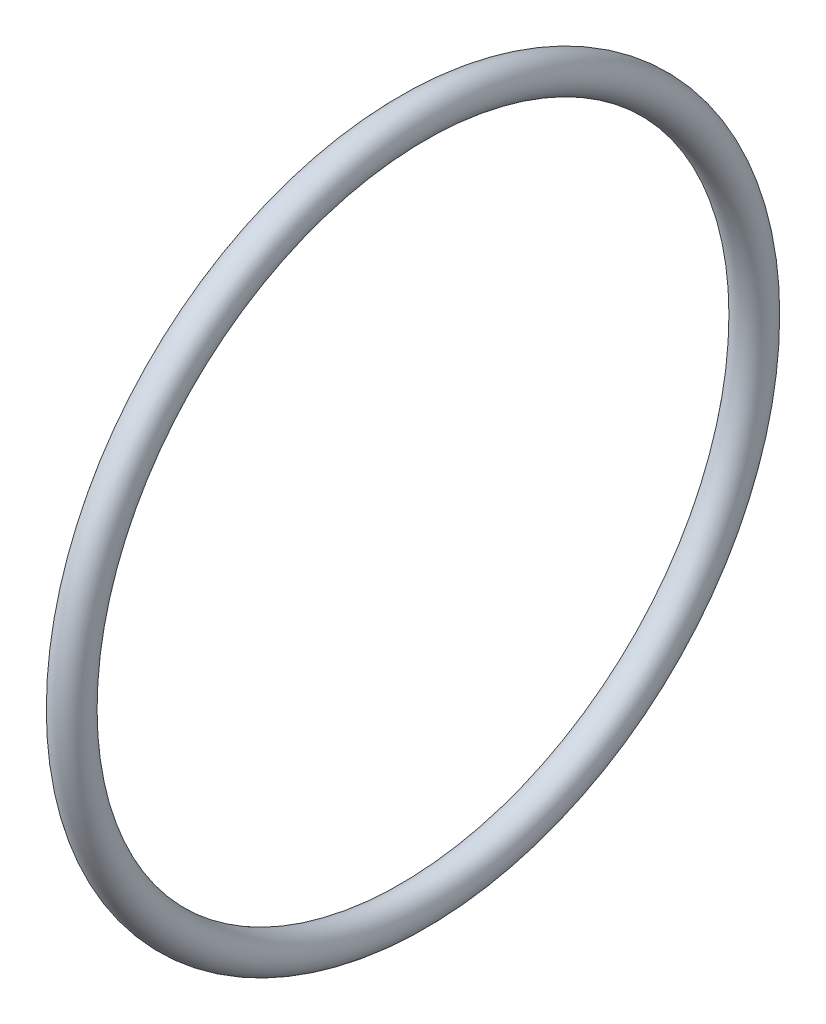
ISO-10303-21;
HEADER;
FILE_DESCRIPTION(('STEP AP214'),'2;1');
FILE_NAME('part.step','',(''),(''),'','','');
FILE_SCHEMA(('AUTOMOTIVE_DESIGN { 1 0 10303 214 1 1 1 1 }'));
ENDSEC;
DATA;
#1=APPLICATION_CONTEXT('core data for automotive mechanical design processes');
#2=APPLICATION_PROTOCOL_DEFINITION('international standard','automotive_design',2000,#1);
#3=PRODUCT_CONTEXT('',#1,'mechanical');
#4=PRODUCT('Part','Part','',(#3));
#5=PRODUCT_RELATED_PRODUCT_CATEGORY('part','',(#4));
#6=PRODUCT_DEFINITION_FORMATION('','',#4);
#7=PRODUCT_DEFINITION_CONTEXT('part definition',#1,'design');
#8=PRODUCT_DEFINITION('design','',#6,#7);
#9=PRODUCT_DEFINITION_SHAPE('','',#8);
#10=(LENGTH_UNIT() NAMED_UNIT(*) SI_UNIT(.MILLI.,.METRE.));
#11=(NAMED_UNIT(*) PLANE_ANGLE_UNIT() SI_UNIT($,.RADIAN.));
#12=(NAMED_UNIT(*) SI_UNIT($,.STERADIAN.) SOLID_ANGLE_UNIT());
#13=UNCERTAINTY_MEASURE_WITH_UNIT(LENGTH_MEASURE(1.E-05),#10,'distance_accuracy_value','');
#14=(GEOMETRIC_REPRESENTATION_CONTEXT(3) GLOBAL_UNCERTAINTY_ASSIGNED_CONTEXT((#13)) GLOBAL_UNIT_ASSIGNED_CONTEXT((#10,
#11,#12)) REPRESENTATION_CONTEXT('',''));
#15=CARTESIAN_POINT('',(0.,0.,0.));
#16=DIRECTION('',(0.,0.,1.));
#17=DIRECTION('',(1.,0.,0.));
#18=AXIS2_PLACEMENT_3D('',#15,#16,#17);
#19=CARTESIAN_POINT('',(0.,-28.5,0.));
#20=DIRECTION('',(-1.,0.,0.));
#21=DIRECTION('',(0.,0.,1.));
#22=AXIS2_PLACEMENT_3D('',#19,#20,#21);
#23=TOROIDAL_SURFACE('',#22,28.5,1.5);
#24=CARTESIAN_POINT('',(0.,-28.5,30.));
#25=VERTEX_POINT('',#24);
#26=VERTEX_LOOP('',#25);
#27=FACE_BOUND('',#26,.T.);
#28=ADVANCED_FACE('F37',(#27),#23,.T.);
#29=CLOSED_SHELL('',(#28));
#30=MANIFOLD_SOLID_BREP('B2',#29);
#31=ADVANCED_BREP_SHAPE_REPRESENTATION('',(#18,#30),#14);
#32=SHAPE_DEFINITION_REPRESENTATION(#9,#31);
ENDSEC;
END-ISO-10303-21;
